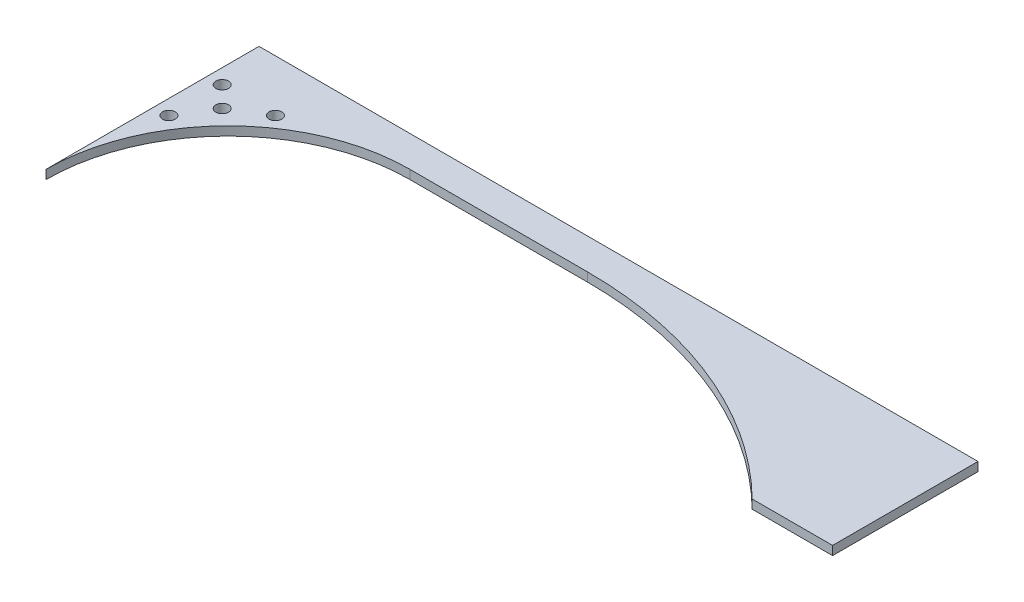
ISO-10303-21;
HEADER;
FILE_DESCRIPTION(('STEP AP214'),'2;1');
FILE_NAME('part.step','',(''),(''),'','','');
FILE_SCHEMA(('AUTOMOTIVE_DESIGN { 1 0 10303 214 1 1 1 1 }'));
ENDSEC;
DATA;
#1=APPLICATION_CONTEXT('core data for automotive mechanical design processes');
#2=APPLICATION_PROTOCOL_DEFINITION('international standard','automotive_design',2000,#1);
#3=PRODUCT_CONTEXT('',#1,'mechanical');
#4=PRODUCT('Part','Part','',(#3));
#5=PRODUCT_RELATED_PRODUCT_CATEGORY('part','',(#4));
#6=PRODUCT_DEFINITION_FORMATION('','',#4);
#7=PRODUCT_DEFINITION_CONTEXT('part definition',#1,'design');
#8=PRODUCT_DEFINITION('design','',#6,#7);
#9=PRODUCT_DEFINITION_SHAPE('','',#8);
#10=(LENGTH_UNIT() NAMED_UNIT(*) SI_UNIT(.MILLI.,.METRE.));
#11=(NAMED_UNIT(*) PLANE_ANGLE_UNIT() SI_UNIT($,.RADIAN.));
#12=(NAMED_UNIT(*) SI_UNIT($,.STERADIAN.) SOLID_ANGLE_UNIT());
#13=UNCERTAINTY_MEASURE_WITH_UNIT(LENGTH_MEASURE(1.E-05),#10,'distance_accuracy_value','');
#14=(GEOMETRIC_REPRESENTATION_CONTEXT(3) GLOBAL_UNCERTAINTY_ASSIGNED_CONTEXT((#13)) GLOBAL_UNIT_ASSIGNED_CONTEXT((#10,
#11,#12)) REPRESENTATION_CONTEXT('',''));
#15=CARTESIAN_POINT('',(0.,0.,0.));
#16=DIRECTION('',(0.,0.,1.));
#17=DIRECTION('',(1.,0.,0.));
#18=AXIS2_PLACEMENT_3D('',#15,#16,#17);
#19=CARTESIAN_POINT('',(0.,6.35,0.));
#20=DIRECTION('',(0.,1.,0.));
#21=DIRECTION('',(0.,0.,1.));
#22=AXIS2_PLACEMENT_3D('',#19,#20,#21);
#23=PLANE('',#22);
#24=CARTESIAN_POINT('',(-208.452544448183,6.35,36.9612395051286));
#25=DIRECTION('',(0.,1.,0.));
#26=DIRECTION('',(0.,0.,1.));
#27=AXIS2_PLACEMENT_3D('',#24,#25,#26);
#28=CIRCLE('',#27,4.57199999999999);
#29=CARTESIAN_POINT('',(-208.452544448183,6.35,41.5332395051286));
#30=VERTEX_POINT('',#29);
#31=EDGE_CURVE('E183',#30,#30,#28,.T.);
#32=ORIENTED_EDGE('',*,*,#31,.F.);
#33=EDGE_LOOP('',(#32));
#34=FACE_BOUND('',#33,.T.);
#35=CARTESIAN_POINT('',(-246.552544448183,6.35,36.9612395051286));
#36=DIRECTION('',(0.,1.,0.));
#37=DIRECTION('',(0.,0.,1.));
#38=AXIS2_PLACEMENT_3D('',#35,#36,#37);
#39=CIRCLE('',#38,4.57199999999999);
#40=CARTESIAN_POINT('',(-246.552544448183,6.35,41.5332395051286));
#41=VERTEX_POINT('',#40);
#42=EDGE_CURVE('E177',#41,#41,#39,.T.);
#43=ORIENTED_EDGE('',*,*,#42,.F.);
#44=EDGE_LOOP('',(#43));
#45=FACE_BOUND('',#44,.T.);
#46=CARTESIAN_POINT('',(-231.855506715659,6.35,51.658277237652));
#47=DIRECTION('',(0.,1.,0.));
#48=DIRECTION('',(0.,0.,1.));
#49=AXIS2_PLACEMENT_3D('',#46,#47,#48);
#50=CIRCLE('',#49,4.57199999999999);
#51=CARTESIAN_POINT('',(-231.855506715659,6.35,56.230277237652));
#52=VERTEX_POINT('',#51);
#53=EDGE_CURVE('E171',#52,#52,#50,.T.);
#54=ORIENTED_EDGE('',*,*,#53,.F.);
#55=EDGE_LOOP('',(#54));
#56=FACE_BOUND('',#55,.T.);
#57=CARTESIAN_POINT('',(-246.552544448183,6.35,75.0612395051286));
#58=DIRECTION('',(0.,1.,0.));
#59=DIRECTION('',(0.,0.,1.));
#60=AXIS2_PLACEMENT_3D('',#57,#58,#59);
#61=CIRCLE('',#60,4.57199999999999);
#62=CARTESIAN_POINT('',(-246.552544448183,6.35,79.6332395051285));
#63=VERTEX_POINT('',#62);
#64=EDGE_CURVE('E165',#63,#63,#61,.T.);
#65=ORIENTED_EDGE('',*,*,#64,.F.);
#66=EDGE_LOOP('',(#65));
#67=FACE_BOUND('',#66,.T.);
#68=DIRECTION('',(0.,0.,-1.));
#69=VECTOR('',#68,1.);
#70=CARTESIAN_POINT('',(-257.175,6.35,0.));
#71=LINE('',#70,#69);
#72=CARTESIAN_POINT('',(-257.175,6.35,152.4));
#73=VERTEX_POINT('',#72);
#74=CARTESIAN_POINT('',(-257.175,6.35,0.));
#75=VERTEX_POINT('',#74);
#76=EDGE_CURVE('E120',#73,#75,#71,.T.);
#77=ORIENTED_EDGE('',*,*,#76,.F.);
#78=CARTESIAN_POINT('',(-127.,6.35,152.4));
#79=DIRECTION('',(0.,1.,0.));
#80=DIRECTION('',(0.,0.,1.));
#81=AXIS2_PLACEMENT_3D('',#78,#79,#80);
#82=CIRCLE('',#81,130.175);
#83=CARTESIAN_POINT('',(-127.,6.35,22.225));
#84=VERTEX_POINT('',#83);
#85=EDGE_CURVE('E145',#84,#73,#82,.T.);
#86=ORIENTED_EDGE('',*,*,#85,.F.);
#87=DIRECTION('',(-1.,0.,0.));
#88=VECTOR('',#87,1.);
#89=CARTESIAN_POINT('',(0.,6.35,22.225));
#90=LINE('',#89,#88);
#91=CARTESIAN_POINT('',(0.,6.35,22.225));
#92=VERTEX_POINT('',#91);
#93=EDGE_CURVE('E159',#92,#84,#90,.T.);
#94=ORIENTED_EDGE('',*,*,#93,.F.);
#95=CARTESIAN_POINT('',(0.,6.35,306.799531512727));
#96=DIRECTION('',(0.,1.,0.));
#97=DIRECTION('',(0.,0.,1.));
#98=AXIS2_PLACEMENT_3D('',#95,#96,#97);
#99=CIRCLE('',#98,284.574531512727);
#100=CARTESIAN_POINT('',(199.670208732562,6.35,104.032493436064));
#101=VERTEX_POINT('',#100);
#102=EDGE_CURVE('E114',#92,#101,#99,.F.);
#103=ORIENTED_EDGE('',*,*,#102,.T.);
#104=DIRECTION('',(-1.,0.,0.));
#105=VECTOR('',#104,1.);
#106=CARTESIAN_POINT('',(0.,6.35,104.032493436064));
#107=LINE('',#106,#105);
#108=CARTESIAN_POINT('',(257.175,6.35,104.032493436064));
#109=VERTEX_POINT('',#108);
#110=EDGE_CURVE('E100',#109,#101,#107,.T.);
#111=ORIENTED_EDGE('',*,*,#110,.F.);
#112=DIRECTION('',(0.,0.,1.));
#113=VECTOR('',#112,1.);
#114=CARTESIAN_POINT('',(257.175,6.35,0.));
#115=LINE('',#114,#113);
#116=CARTESIAN_POINT('',(257.175,6.35,0.));
#117=VERTEX_POINT('',#116);
#118=EDGE_CURVE('E111',#117,#109,#115,.T.);
#119=ORIENTED_EDGE('',*,*,#118,.F.);
#120=DIRECTION('',(1.,0.,0.));
#121=VECTOR('',#120,1.);
#122=CARTESIAN_POINT('',(0.,6.35,0.));
#123=LINE('',#122,#121);
#124=EDGE_CURVE('E118',#75,#117,#123,.T.);
#125=ORIENTED_EDGE('',*,*,#124,.F.);
#126=EDGE_LOOP('',(#77,#86,#94,#103,#111,#119,#125));
#127=FACE_BOUND('',#126,.T.);
#128=ADVANCED_FACE('F35',(#34,#45,#56,#67,#127),#23,.T.);
#129=CARTESIAN_POINT('',(0.,0.,0.));
#130=DIRECTION('',(0.,1.,0.));
#131=DIRECTION('',(0.,0.,1.));
#132=AXIS2_PLACEMENT_3D('',#129,#130,#131);
#133=PLANE('',#132);
#134=CARTESIAN_POINT('',(-208.452544448183,0.,36.9612395051286));
#135=DIRECTION('',(0.,1.,0.));
#136=DIRECTION('',(0.,0.,1.));
#137=AXIS2_PLACEMENT_3D('',#134,#135,#136);
#138=CIRCLE('',#137,4.57199999999999);
#139=CARTESIAN_POINT('',(-208.452544448183,0.,41.5332395051286));
#140=VERTEX_POINT('',#139);
#141=EDGE_CURVE('E130',#140,#140,#138,.T.);
#142=ORIENTED_EDGE('',*,*,#141,.T.);
#143=EDGE_LOOP('',(#142));
#144=FACE_BOUND('',#143,.T.);
#145=CARTESIAN_POINT('',(-246.552544448183,0.,36.9612395051286));
#146=DIRECTION('',(0.,1.,0.));
#147=DIRECTION('',(0.,0.,1.));
#148=AXIS2_PLACEMENT_3D('',#145,#146,#147);
#149=CIRCLE('',#148,4.57199999999999);
#150=CARTESIAN_POINT('',(-246.552544448183,0.,41.5332395051286));
#151=VERTEX_POINT('',#150);
#152=EDGE_CURVE('E180',#151,#151,#149,.T.);
#153=ORIENTED_EDGE('',*,*,#152,.T.);
#154=EDGE_LOOP('',(#153));
#155=FACE_BOUND('',#154,.T.);
#156=CARTESIAN_POINT('',(-231.855506715659,0.,51.658277237652));
#157=DIRECTION('',(0.,1.,0.));
#158=DIRECTION('',(0.,0.,1.));
#159=AXIS2_PLACEMENT_3D('',#156,#157,#158);
#160=CIRCLE('',#159,4.57199999999999);
#161=CARTESIAN_POINT('',(-231.855506715659,0.,56.230277237652));
#162=VERTEX_POINT('',#161);
#163=EDGE_CURVE('E174',#162,#162,#160,.T.);
#164=ORIENTED_EDGE('',*,*,#163,.T.);
#165=EDGE_LOOP('',(#164));
#166=FACE_BOUND('',#165,.T.);
#167=CARTESIAN_POINT('',(-246.552544448183,0.,75.0612395051286));
#168=DIRECTION('',(0.,1.,0.));
#169=DIRECTION('',(0.,0.,1.));
#170=AXIS2_PLACEMENT_3D('',#167,#168,#169);
#171=CIRCLE('',#170,4.57199999999999);
#172=CARTESIAN_POINT('',(-246.552544448183,0.,79.6332395051285));
#173=VERTEX_POINT('',#172);
#174=EDGE_CURVE('E168',#173,#173,#171,.T.);
#175=ORIENTED_EDGE('',*,*,#174,.T.);
#176=EDGE_LOOP('',(#175));
#177=FACE_BOUND('',#176,.T.);
#178=CARTESIAN_POINT('',(-127.,0.,152.4));
#179=DIRECTION('',(0.,1.,0.));
#180=DIRECTION('',(0.,0.,1.));
#181=AXIS2_PLACEMENT_3D('',#178,#179,#180);
#182=CIRCLE('',#181,130.175);
#183=CARTESIAN_POINT('',(-127.,0.,22.225));
#184=VERTEX_POINT('',#183);
#185=CARTESIAN_POINT('',(-257.175,0.,152.4));
#186=VERTEX_POINT('',#185);
#187=EDGE_CURVE('E126',#184,#186,#182,.T.);
#188=ORIENTED_EDGE('',*,*,#187,.T.);
#189=DIRECTION('',(0.,0.,-1.));
#190=VECTOR('',#189,1.);
#191=CARTESIAN_POINT('',(-257.175,0.,0.));
#192=LINE('',#191,#190);
#193=CARTESIAN_POINT('',(-257.175,0.,0.));
#194=VERTEX_POINT('',#193);
#195=EDGE_CURVE('E142',#186,#194,#192,.T.);
#196=ORIENTED_EDGE('',*,*,#195,.T.);
#197=DIRECTION('',(1.,0.,0.));
#198=VECTOR('',#197,1.);
#199=CARTESIAN_POINT('',(0.,0.,0.));
#200=LINE('',#199,#198);
#201=CARTESIAN_POINT('',(257.175,0.,0.));
#202=VERTEX_POINT('',#201);
#203=EDGE_CURVE('E139',#194,#202,#200,.T.);
#204=ORIENTED_EDGE('',*,*,#203,.T.);
#205=DIRECTION('',(0.,0.,1.));
#206=VECTOR('',#205,1.);
#207=CARTESIAN_POINT('',(257.175,0.,0.));
#208=LINE('',#207,#206);
#209=CARTESIAN_POINT('',(257.175,0.,104.032493436064));
#210=VERTEX_POINT('',#209);
#211=EDGE_CURVE('E137',#202,#210,#208,.T.);
#212=ORIENTED_EDGE('',*,*,#211,.T.);
#213=DIRECTION('',(-1.,0.,0.));
#214=VECTOR('',#213,1.);
#215=CARTESIAN_POINT('',(0.,0.,104.032493436064));
#216=LINE('',#215,#214);
#217=CARTESIAN_POINT('',(199.670208732562,0.,104.032493436064));
#218=VERTEX_POINT('',#217);
#219=EDGE_CURVE('E102',#210,#218,#216,.T.);
#220=ORIENTED_EDGE('',*,*,#219,.T.);
#221=CARTESIAN_POINT('',(0.,0.,306.799531512727));
#222=DIRECTION('',(0.,1.,0.));
#223=DIRECTION('',(0.,0.,1.));
#224=AXIS2_PLACEMENT_3D('',#221,#222,#223);
#225=CIRCLE('',#224,284.574531512727);
#226=CARTESIAN_POINT('',(0.,0.,22.225));
#227=VERTEX_POINT('',#226);
#228=EDGE_CURVE('E133',#227,#218,#225,.F.);
#229=ORIENTED_EDGE('',*,*,#228,.F.);
#230=DIRECTION('',(-1.,0.,0.));
#231=VECTOR('',#230,1.);
#232=CARTESIAN_POINT('',(0.,0.,22.225));
#233=LINE('',#232,#231);
#234=EDGE_CURVE('E129',#227,#184,#233,.T.);
#235=ORIENTED_EDGE('',*,*,#234,.T.);
#236=EDGE_LOOP('',(#188,#196,#204,#212,#220,#229,#235));
#237=FACE_BOUND('',#236,.T.);
#238=ADVANCED_FACE('F157',(#144,#155,#166,#177,#237),#133,.F.);
#239=CARTESIAN_POINT('',(-127.,6.35,152.4));
#240=DIRECTION('',(0.,-1.,0.));
#241=DIRECTION('',(0.,0.,-1.));
#242=AXIS2_PLACEMENT_3D('',#239,#240,#241);
#243=CYLINDRICAL_SURFACE('',#242,130.175);
#244=ORIENTED_EDGE('',*,*,#187,.F.);
#245=DIRECTION('',(0.,-1.,0.));
#246=VECTOR('',#245,1.);
#247=CARTESIAN_POINT('',(-127.,6.35,22.225));
#248=LINE('',#247,#246);
#249=EDGE_CURVE('E11',#84,#184,#248,.T.);
#250=ORIENTED_EDGE('',*,*,#249,.F.);
#251=ORIENTED_EDGE('',*,*,#85,.T.);
#252=DIRECTION('',(0.,-1.,0.));
#253=VECTOR('',#252,1.);
#254=CARTESIAN_POINT('',(-257.175,6.35,152.4));
#255=LINE('',#254,#253);
#256=EDGE_CURVE('E125',#73,#186,#255,.T.);
#257=ORIENTED_EDGE('',*,*,#256,.T.);
#258=EDGE_LOOP('',(#244,#250,#251,#257));
#259=FACE_BOUND('',#258,.T.);
#260=ADVANCED_FACE('F37',(#259),#243,.F.);
#261=CARTESIAN_POINT('',(0.,6.35,22.225));
#262=DIRECTION('',(0.,0.,1.));
#263=DIRECTION('',(1.,0.,0.));
#264=AXIS2_PLACEMENT_3D('',#261,#262,#263);
#265=PLANE('',#264);
#266=ORIENTED_EDGE('',*,*,#234,.F.);
#267=DIRECTION('',(0.,-1.,0.));
#268=VECTOR('',#267,1.);
#269=CARTESIAN_POINT('',(0.,6.35,22.225));
#270=LINE('',#269,#268);
#271=EDGE_CURVE('E44',#92,#227,#270,.T.);
#272=ORIENTED_EDGE('',*,*,#271,.F.);
#273=ORIENTED_EDGE('',*,*,#93,.T.);
#274=ORIENTED_EDGE('',*,*,#249,.T.);
#275=EDGE_LOOP('',(#266,#272,#273,#274));
#276=FACE_BOUND('',#275,.T.);
#277=ADVANCED_FACE('F158',(#276),#265,.T.);
#278=CARTESIAN_POINT('',(0.,6.35,306.799531512727));
#279=DIRECTION('',(0.,-1.,0.));
#280=DIRECTION('',(0.,0.,-1.));
#281=AXIS2_PLACEMENT_3D('',#278,#279,#280);
#282=CYLINDRICAL_SURFACE('',#281,284.574531512727);
#283=ORIENTED_EDGE('',*,*,#228,.T.);
#284=DIRECTION('',(0.,-1.,0.));
#285=VECTOR('',#284,1.);
#286=CARTESIAN_POINT('',(199.670208732562,6.35,104.032493436064));
#287=LINE('',#286,#285);
#288=EDGE_CURVE('E106',#101,#218,#287,.T.);
#289=ORIENTED_EDGE('',*,*,#288,.F.);
#290=ORIENTED_EDGE('',*,*,#102,.F.);
#291=ORIENTED_EDGE('',*,*,#271,.T.);
#292=EDGE_LOOP('',(#283,#289,#290,#291));
#293=FACE_BOUND('',#292,.T.);
#294=ADVANCED_FACE('F152',(#293),#282,.F.);
#295=CARTESIAN_POINT('',(0.,6.35,104.032493436064));
#296=DIRECTION('',(0.,0.,1.));
#297=DIRECTION('',(1.,0.,0.));
#298=AXIS2_PLACEMENT_3D('',#295,#296,#297);
#299=PLANE('',#298);
#300=ORIENTED_EDGE('',*,*,#219,.F.);
#301=DIRECTION('',(0.,-1.,0.));
#302=VECTOR('',#301,1.);
#303=CARTESIAN_POINT('',(257.175,6.35,104.032493436064));
#304=LINE('',#303,#302);
#305=EDGE_CURVE('E97',#109,#210,#304,.T.);
#306=ORIENTED_EDGE('',*,*,#305,.F.);
#307=ORIENTED_EDGE('',*,*,#110,.T.);
#308=ORIENTED_EDGE('',*,*,#288,.T.);
#309=EDGE_LOOP('',(#300,#306,#307,#308));
#310=FACE_BOUND('',#309,.T.);
#311=ADVANCED_FACE('F99',(#310),#299,.T.);
#312=CARTESIAN_POINT('',(257.175,6.35,0.));
#313=DIRECTION('',(1.,0.,0.));
#314=DIRECTION('',(0.,0.,-1.));
#315=AXIS2_PLACEMENT_3D('',#312,#313,#314);
#316=PLANE('',#315);
#317=ORIENTED_EDGE('',*,*,#211,.F.);
#318=DIRECTION('',(0.,-1.,0.));
#319=VECTOR('',#318,1.);
#320=CARTESIAN_POINT('',(257.175,6.35,0.));
#321=LINE('',#320,#319);
#322=EDGE_CURVE('E72',#117,#202,#321,.T.);
#323=ORIENTED_EDGE('',*,*,#322,.F.);
#324=ORIENTED_EDGE('',*,*,#118,.T.);
#325=ORIENTED_EDGE('',*,*,#305,.T.);
#326=EDGE_LOOP('',(#317,#323,#324,#325));
#327=FACE_BOUND('',#326,.T.);
#328=ADVANCED_FACE('F117',(#327),#316,.T.);
#329=CARTESIAN_POINT('',(0.,6.35,0.));
#330=DIRECTION('',(0.,0.,-1.));
#331=DIRECTION('',(-1.,0.,0.));
#332=AXIS2_PLACEMENT_3D('',#329,#330,#331);
#333=PLANE('',#332);
#334=ORIENTED_EDGE('',*,*,#203,.F.);
#335=DIRECTION('',(0.,-1.,0.));
#336=VECTOR('',#335,1.);
#337=CARTESIAN_POINT('',(-257.175,6.35,0.));
#338=LINE('',#337,#336);
#339=EDGE_CURVE('E52',#75,#194,#338,.T.);
#340=ORIENTED_EDGE('',*,*,#339,.F.);
#341=ORIENTED_EDGE('',*,*,#124,.T.);
#342=ORIENTED_EDGE('',*,*,#322,.T.);
#343=EDGE_LOOP('',(#334,#340,#341,#342));
#344=FACE_BOUND('',#343,.T.);
#345=ADVANCED_FACE('F218',(#344),#333,.T.);
#346=CARTESIAN_POINT('',(-257.175,6.35,0.));
#347=DIRECTION('',(-1.,0.,0.));
#348=DIRECTION('',(0.,0.,1.));
#349=AXIS2_PLACEMENT_3D('',#346,#347,#348);
#350=PLANE('',#349);
#351=ORIENTED_EDGE('',*,*,#195,.F.);
#352=ORIENTED_EDGE('',*,*,#256,.F.);
#353=ORIENTED_EDGE('',*,*,#76,.T.);
#354=ORIENTED_EDGE('',*,*,#339,.T.);
#355=EDGE_LOOP('',(#351,#352,#353,#354));
#356=FACE_BOUND('',#355,.T.);
#357=ADVANCED_FACE('F161',(#356),#350,.T.);
#358=CARTESIAN_POINT('',(-246.552544448183,0.,75.0612395051286));
#359=DIRECTION('',(0.,1.,0.));
#360=DIRECTION('',(0.,0.,1.));
#361=AXIS2_PLACEMENT_3D('',#358,#359,#360);
#362=CYLINDRICAL_SURFACE('',#361,4.57199999999999);
#363=ORIENTED_EDGE('',*,*,#174,.F.);
#364=EDGE_LOOP('',(#363));
#365=FACE_BOUND('',#364,.T.);
#366=ORIENTED_EDGE('',*,*,#64,.T.);
#367=EDGE_LOOP('',(#366));
#368=FACE_BOUND('',#367,.T.);
#369=ADVANCED_FACE('F207',(#365,#368),#362,.F.);
#370=CARTESIAN_POINT('',(-231.855506715659,0.,51.658277237652));
#371=DIRECTION('',(0.,1.,0.));
#372=DIRECTION('',(0.,0.,1.));
#373=AXIS2_PLACEMENT_3D('',#370,#371,#372);
#374=CYLINDRICAL_SURFACE('',#373,4.57199999999999);
#375=ORIENTED_EDGE('',*,*,#163,.F.);
#376=EDGE_LOOP('',(#375));
#377=FACE_BOUND('',#376,.T.);
#378=ORIENTED_EDGE('',*,*,#53,.T.);
#379=EDGE_LOOP('',(#378));
#380=FACE_BOUND('',#379,.T.);
#381=ADVANCED_FACE('F209',(#377,#380),#374,.F.);
#382=CARTESIAN_POINT('',(-246.552544448183,0.,36.9612395051286));
#383=DIRECTION('',(0.,1.,0.));
#384=DIRECTION('',(0.,0.,1.));
#385=AXIS2_PLACEMENT_3D('',#382,#383,#384);
#386=CYLINDRICAL_SURFACE('',#385,4.57199999999999);
#387=ORIENTED_EDGE('',*,*,#152,.F.);
#388=EDGE_LOOP('',(#387));
#389=FACE_BOUND('',#388,.T.);
#390=ORIENTED_EDGE('',*,*,#42,.T.);
#391=EDGE_LOOP('',(#390));
#392=FACE_BOUND('',#391,.T.);
#393=ADVANCED_FACE('F194',(#389,#392),#386,.F.);
#394=CARTESIAN_POINT('',(-208.452544448183,0.,36.9612395051286));
#395=DIRECTION('',(0.,1.,0.));
#396=DIRECTION('',(0.,0.,1.));
#397=AXIS2_PLACEMENT_3D('',#394,#395,#396);
#398=CYLINDRICAL_SURFACE('',#397,4.57199999999999);
#399=ORIENTED_EDGE('',*,*,#141,.F.);
#400=EDGE_LOOP('',(#399));
#401=FACE_BOUND('',#400,.T.);
#402=ORIENTED_EDGE('',*,*,#31,.T.);
#403=EDGE_LOOP('',(#402));
#404=FACE_BOUND('',#403,.T.);
#405=ADVANCED_FACE('F191',(#401,#404),#398,.F.);
#406=CLOSED_SHELL('',(#128,#238,#260,#277,#294,#311,#328,#345,#357,#369,#381,#393,#405));
#407=MANIFOLD_SOLID_BREP('B2',#406);
#408=ADVANCED_BREP_SHAPE_REPRESENTATION('',(#18,#407),#14);
#409=SHAPE_DEFINITION_REPRESENTATION(#9,#408);
ENDSEC;
END-ISO-10303-21;
